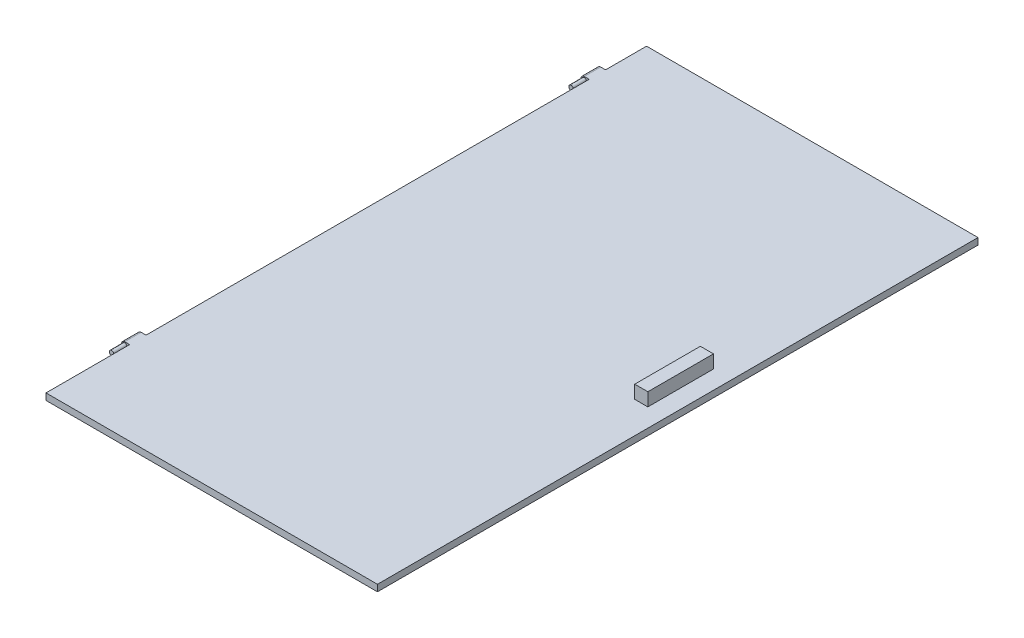
ISO-10303-21;
HEADER;
FILE_DESCRIPTION(('STEP AP214'),'2;1');
FILE_NAME('part.step','',(''),(''),'','','');
FILE_SCHEMA(('AUTOMOTIVE_DESIGN { 1 0 10303 214 1 1 1 1 }'));
ENDSEC;
DATA;
#1=APPLICATION_CONTEXT('core data for automotive mechanical design processes');
#2=APPLICATION_PROTOCOL_DEFINITION('international standard','automotive_design',2000,#1);
#3=PRODUCT_CONTEXT('',#1,'mechanical');
#4=PRODUCT('Part','Part','',(#3));
#5=PRODUCT_RELATED_PRODUCT_CATEGORY('part','',(#4));
#6=PRODUCT_DEFINITION_FORMATION('','',#4);
#7=PRODUCT_DEFINITION_CONTEXT('part definition',#1,'design');
#8=PRODUCT_DEFINITION('design','',#6,#7);
#9=PRODUCT_DEFINITION_SHAPE('','',#8);
#10=(LENGTH_UNIT() NAMED_UNIT(*) SI_UNIT(.MILLI.,.METRE.));
#11=(NAMED_UNIT(*) PLANE_ANGLE_UNIT() SI_UNIT($,.RADIAN.));
#12=(NAMED_UNIT(*) SI_UNIT($,.STERADIAN.) SOLID_ANGLE_UNIT());
#13=UNCERTAINTY_MEASURE_WITH_UNIT(LENGTH_MEASURE(1.E-05),#10,'distance_accuracy_value','');
#14=(GEOMETRIC_REPRESENTATION_CONTEXT(3) GLOBAL_UNCERTAINTY_ASSIGNED_CONTEXT((#13)) GLOBAL_UNIT_ASSIGNED_CONTEXT((#10,
#11,#12)) REPRESENTATION_CONTEXT('',''));
#15=CARTESIAN_POINT('',(0.,0.,0.));
#16=DIRECTION('',(0.,0.,1.));
#17=DIRECTION('',(1.,0.,0.));
#18=AXIS2_PLACEMENT_3D('',#15,#16,#17);
#19=CARTESIAN_POINT('',(0.,10.,0.));
#20=DIRECTION('',(0.,1.,0.));
#21=DIRECTION('',(0.,0.,1.));
#22=AXIS2_PLACEMENT_3D('',#19,#20,#21);
#23=PLANE('',#22);
#24=DIRECTION('',(1.,0.,0.));
#25=VECTOR('',#24,1.);
#26=CARTESIAN_POINT('',(-272.5,10.0000000000001,337.5));
#27=LINE('',#26,#25);
#28=CARTESIAN_POINT('',(-267.5,10.0000000000001,337.5));
#29=VERTEX_POINT('',#28);
#30=CARTESIAN_POINT('',(-260.,10.,337.5));
#31=VERTEX_POINT('',#30);
#32=EDGE_CURVE('E203',#29,#31,#27,.T.);
#33=ORIENTED_EDGE('',*,*,#32,.F.);
#34=DIRECTION('',(0.,0.,-1.));
#35=VECTOR('',#34,1.);
#36=CARTESIAN_POINT('',(-267.5,10.,362.5));
#37=LINE('',#36,#35);
#38=CARTESIAN_POINT('',(-267.5,10.0000000000001,362.5));
#39=VERTEX_POINT('',#38);
#40=EDGE_CURVE('E279',#29,#39,#37,.F.);
#41=ORIENTED_EDGE('',*,*,#40,.T.);
#42=DIRECTION('',(1.,0.,0.));
#43=VECTOR('',#42,1.);
#44=CARTESIAN_POINT('',(-272.5,10.0000000000001,362.5));
#45=LINE('',#44,#43);
#46=CARTESIAN_POINT('',(-260.,10.,362.5));
#47=VERTEX_POINT('',#46);
#48=EDGE_CURVE('E205',#39,#47,#45,.T.);
#49=ORIENTED_EDGE('',*,*,#48,.T.);
#50=DIRECTION('',(0.,0.,1.));
#51=VECTOR('',#50,1.);
#52=CARTESIAN_POINT('',(-260.,10.,490.));
#53=LINE('',#52,#51);
#54=CARTESIAN_POINT('',(-260.,10.,490.));
#55=VERTEX_POINT('',#54);
#56=EDGE_CURVE('E229',#47,#55,#53,.T.);
#57=ORIENTED_EDGE('',*,*,#56,.T.);
#58=DIRECTION('',(1.,0.,0.));
#59=VECTOR('',#58,1.);
#60=CARTESIAN_POINT('',(245.,10.,490.));
#61=LINE('',#60,#59);
#62=CARTESIAN_POINT('',(245.,10.,490.));
#63=VERTEX_POINT('',#62);
#64=EDGE_CURVE('E227',#55,#63,#61,.T.);
#65=ORIENTED_EDGE('',*,*,#64,.T.);
#66=DIRECTION('',(0.,0.,-1.));
#67=VECTOR('',#66,1.);
#68=CARTESIAN_POINT('',(245.,10.,490.));
#69=LINE('',#68,#67);
#70=CARTESIAN_POINT('',(245.,10.,-425.));
#71=VERTEX_POINT('',#70);
#72=EDGE_CURVE('E231',#63,#71,#69,.T.);
#73=ORIENTED_EDGE('',*,*,#72,.T.);
#74=DIRECTION('',(-1.,0.,0.));
#75=VECTOR('',#74,1.);
#76=CARTESIAN_POINT('',(245.,10.,-425.));
#77=LINE('',#76,#75);
#78=CARTESIAN_POINT('',(-260.,10.,-425.));
#79=VERTEX_POINT('',#78);
#80=EDGE_CURVE('E233',#71,#79,#77,.T.);
#81=ORIENTED_EDGE('',*,*,#80,.T.);
#82=CARTESIAN_POINT('',(-260.,10.,-362.5));
#83=VERTEX_POINT('',#82);
#84=EDGE_CURVE('E224',#79,#83,#53,.T.);
#85=ORIENTED_EDGE('',*,*,#84,.T.);
#86=DIRECTION('',(1.,0.,0.));
#87=VECTOR('',#86,1.);
#88=CARTESIAN_POINT('',(-272.5,10.,-362.5));
#89=LINE('',#88,#87);
#90=CARTESIAN_POINT('',(-267.5,10.,-362.5));
#91=VERTEX_POINT('',#90);
#92=EDGE_CURVE('E219',#91,#83,#89,.T.);
#93=ORIENTED_EDGE('',*,*,#92,.F.);
#94=DIRECTION('',(0.,0.,-1.));
#95=VECTOR('',#94,1.);
#96=CARTESIAN_POINT('',(-267.5,10.,-337.5));
#97=LINE('',#96,#95);
#98=CARTESIAN_POINT('',(-267.5,10.,-337.5));
#99=VERTEX_POINT('',#98);
#100=EDGE_CURVE('E277',#91,#99,#97,.F.);
#101=ORIENTED_EDGE('',*,*,#100,.T.);
#102=DIRECTION('',(1.,0.,0.));
#103=VECTOR('',#102,1.);
#104=CARTESIAN_POINT('',(-272.5,10.,-337.5));
#105=LINE('',#104,#103);
#106=CARTESIAN_POINT('',(-260.,10.,-337.5));
#107=VERTEX_POINT('',#106);
#108=EDGE_CURVE('E221',#99,#107,#105,.T.);
#109=ORIENTED_EDGE('',*,*,#108,.T.);
#110=EDGE_CURVE('E228',#107,#31,#53,.T.);
#111=ORIENTED_EDGE('',*,*,#110,.T.);
#112=EDGE_LOOP('',(#33,#41,#49,#57,#65,#73,#81,#85,#93,#101,#109,#111));
#113=FACE_BOUND('',#112,.T.);
#114=DIRECTION('',(1.,0.,0.));
#115=VECTOR('',#114,1.);
#116=CARTESIAN_POINT('',(216.961175433675,10.,49.9999999999999));
#117=LINE('',#116,#115);
#118=CARTESIAN_POINT('',(196.961175433675,10.,49.9999999999999));
#119=VERTEX_POINT('',#118);
#120=CARTESIAN_POINT('',(216.961175433675,10.,49.9999999999999));
#121=VERTEX_POINT('',#120);
#122=EDGE_CURVE('E586',#119,#121,#117,.T.);
#123=ORIENTED_EDGE('',*,*,#122,.F.);
#124=DIRECTION('',(0.,0.,1.));
#125=VECTOR('',#124,1.);
#126=CARTESIAN_POINT('',(196.961175433675,10.,49.9999999999999));
#127=LINE('',#126,#125);
#128=CARTESIAN_POINT('',(196.961175433675,10.,-50.0000000000001));
#129=VERTEX_POINT('',#128);
#130=EDGE_CURVE('E181',#129,#119,#127,.T.);
#131=ORIENTED_EDGE('',*,*,#130,.F.);
#132=DIRECTION('',(-1.,0.,0.));
#133=VECTOR('',#132,1.);
#134=CARTESIAN_POINT('',(216.961175433675,10.,-50.0000000000001));
#135=LINE('',#134,#133);
#136=CARTESIAN_POINT('',(216.961175433675,10.,-50.0000000000001));
#137=VERTEX_POINT('',#136);
#138=EDGE_CURVE('E177',#137,#129,#135,.T.);
#139=ORIENTED_EDGE('',*,*,#138,.F.);
#140=DIRECTION('',(0.,0.,-1.));
#141=VECTOR('',#140,1.);
#142=CARTESIAN_POINT('',(216.961175433675,10.,49.9999999999999));
#143=LINE('',#142,#141);
#144=EDGE_CURVE('E583',#121,#137,#143,.T.);
#145=ORIENTED_EDGE('',*,*,#144,.F.);
#146=EDGE_LOOP('',(#123,#131,#139,#145));
#147=FACE_BOUND('',#146,.T.);
#148=ADVANCED_FACE('F33',(#113,#147),#23,.T.);
#149=CARTESIAN_POINT('',(-260.,10.,490.));
#150=DIRECTION('',(1.,0.,0.));
#151=DIRECTION('',(0.,0.,-1.));
#152=AXIS2_PLACEMENT_3D('',#149,#150,#151);
#153=PLANE('',#152);
#154=DIRECTION('',(0.,1.,0.));
#155=VECTOR('',#154,1.);
#156=CARTESIAN_POINT('',(-260.,0.,362.5));
#157=LINE('',#156,#155);
#158=CARTESIAN_POINT('',(-260.,0.,362.5));
#159=VERTEX_POINT('',#158);
#160=EDGE_CURVE('E195',#159,#47,#157,.T.);
#161=ORIENTED_EDGE('',*,*,#160,.F.);
#162=DIRECTION('',(0.,0.,1.));
#163=VECTOR('',#162,1.);
#164=CARTESIAN_POINT('',(-260.,0.,490.));
#165=LINE('',#164,#163);
#166=CARTESIAN_POINT('',(-260.,0.,490.));
#167=VERTEX_POINT('',#166);
#168=EDGE_CURVE('E223',#159,#167,#165,.T.);
#169=ORIENTED_EDGE('',*,*,#168,.T.);
#170=DIRECTION('',(0.,-1.,0.));
#171=VECTOR('',#170,1.);
#172=CARTESIAN_POINT('',(-260.,10.,490.));
#173=LINE('',#172,#171);
#174=EDGE_CURVE('E254',#55,#167,#173,.T.);
#175=ORIENTED_EDGE('',*,*,#174,.F.);
#176=ORIENTED_EDGE('',*,*,#56,.F.);
#177=EDGE_LOOP('',(#161,#169,#175,#176));
#178=FACE_BOUND('',#177,.T.);
#179=ADVANCED_FACE('F318',(#178),#153,.F.);
#180=DIRECTION('',(0.,-1.,0.));
#181=VECTOR('',#180,1.);
#182=CARTESIAN_POINT('',(-260.,0.,337.5));
#183=LINE('',#182,#181);
#184=CARTESIAN_POINT('',(-260.,0.,337.5));
#185=VERTEX_POINT('',#184);
#186=EDGE_CURVE('E198',#31,#185,#183,.T.);
#187=ORIENTED_EDGE('',*,*,#186,.F.);
#188=ORIENTED_EDGE('',*,*,#110,.F.);
#189=DIRECTION('',(0.,1.,0.));
#190=VECTOR('',#189,1.);
#191=CARTESIAN_POINT('',(-260.,0.,-337.5));
#192=LINE('',#191,#190);
#193=CARTESIAN_POINT('',(-260.,0.,-337.5));
#194=VERTEX_POINT('',#193);
#195=EDGE_CURVE('E209',#194,#107,#192,.T.);
#196=ORIENTED_EDGE('',*,*,#195,.F.);
#197=EDGE_CURVE('E240',#194,#185,#165,.T.);
#198=ORIENTED_EDGE('',*,*,#197,.T.);
#199=EDGE_LOOP('',(#187,#188,#196,#198));
#200=FACE_BOUND('',#199,.T.);
#201=ADVANCED_FACE('F350',(#200),#153,.F.);
#202=DIRECTION('',(0.,-1.,0.));
#203=VECTOR('',#202,1.);
#204=CARTESIAN_POINT('',(-260.,0.,-362.5));
#205=LINE('',#204,#203);
#206=CARTESIAN_POINT('',(-260.,0.,-362.5));
#207=VERTEX_POINT('',#206);
#208=EDGE_CURVE('E212',#83,#207,#205,.T.);
#209=ORIENTED_EDGE('',*,*,#208,.F.);
#210=ORIENTED_EDGE('',*,*,#84,.F.);
#211=DIRECTION('',(0.,-1.,0.));
#212=VECTOR('',#211,1.);
#213=CARTESIAN_POINT('',(-260.,10.,-425.));
#214=LINE('',#213,#212);
#215=CARTESIAN_POINT('',(-260.,0.,-425.));
#216=VERTEX_POINT('',#215);
#217=EDGE_CURVE('E235',#79,#216,#214,.T.);
#218=ORIENTED_EDGE('',*,*,#217,.T.);
#219=EDGE_CURVE('E236',#216,#207,#165,.T.);
#220=ORIENTED_EDGE('',*,*,#219,.T.);
#221=EDGE_LOOP('',(#209,#210,#218,#220));
#222=FACE_BOUND('',#221,.T.);
#223=ADVANCED_FACE('F338',(#222),#153,.F.);
#224=CARTESIAN_POINT('',(245.,10.,490.));
#225=DIRECTION('',(0.,0.,-1.));
#226=DIRECTION('',(-1.,0.,0.));
#227=AXIS2_PLACEMENT_3D('',#224,#225,#226);
#228=PLANE('',#227);
#229=DIRECTION('',(1.,0.,0.));
#230=VECTOR('',#229,1.);
#231=CARTESIAN_POINT('',(245.,0.,490.));
#232=LINE('',#231,#230);
#233=CARTESIAN_POINT('',(245.,0.,490.));
#234=VERTEX_POINT('',#233);
#235=EDGE_CURVE('E239',#167,#234,#232,.T.);
#236=ORIENTED_EDGE('',*,*,#235,.T.);
#237=DIRECTION('',(0.,-1.,0.));
#238=VECTOR('',#237,1.);
#239=CARTESIAN_POINT('',(245.,10.,490.));
#240=LINE('',#239,#238);
#241=EDGE_CURVE('E251',#63,#234,#240,.T.);
#242=ORIENTED_EDGE('',*,*,#241,.F.);
#243=ORIENTED_EDGE('',*,*,#64,.F.);
#244=ORIENTED_EDGE('',*,*,#174,.T.);
#245=EDGE_LOOP('',(#236,#242,#243,#244));
#246=FACE_BOUND('',#245,.T.);
#247=ADVANCED_FACE('F316',(#246),#228,.F.);
#248=CARTESIAN_POINT('',(245.,10.,490.));
#249=DIRECTION('',(-1.,0.,0.));
#250=DIRECTION('',(0.,0.,1.));
#251=AXIS2_PLACEMENT_3D('',#248,#249,#250);
#252=PLANE('',#251);
#253=DIRECTION('',(0.,0.,-1.));
#254=VECTOR('',#253,1.);
#255=CARTESIAN_POINT('',(245.,0.,490.));
#256=LINE('',#255,#254);
#257=CARTESIAN_POINT('',(245.,0.,-425.));
#258=VERTEX_POINT('',#257);
#259=EDGE_CURVE('E242',#234,#258,#256,.T.);
#260=ORIENTED_EDGE('',*,*,#259,.T.);
#261=DIRECTION('',(0.,-1.,0.));
#262=VECTOR('',#261,1.);
#263=CARTESIAN_POINT('',(245.,10.,-425.));
#264=LINE('',#263,#262);
#265=EDGE_CURVE('E248',#71,#258,#264,.T.);
#266=ORIENTED_EDGE('',*,*,#265,.F.);
#267=ORIENTED_EDGE('',*,*,#72,.F.);
#268=ORIENTED_EDGE('',*,*,#241,.T.);
#269=EDGE_LOOP('',(#260,#266,#267,#268));
#270=FACE_BOUND('',#269,.T.);
#271=ADVANCED_FACE('F327',(#270),#252,.F.);
#272=CARTESIAN_POINT('',(245.,10.,-425.));
#273=DIRECTION('',(0.,0.,1.));
#274=DIRECTION('',(1.,0.,0.));
#275=AXIS2_PLACEMENT_3D('',#272,#273,#274);
#276=PLANE('',#275);
#277=DIRECTION('',(-1.,0.,0.));
#278=VECTOR('',#277,1.);
#279=CARTESIAN_POINT('',(245.,0.,-425.));
#280=LINE('',#279,#278);
#281=EDGE_CURVE('E244',#258,#216,#280,.T.);
#282=ORIENTED_EDGE('',*,*,#281,.T.);
#283=ORIENTED_EDGE('',*,*,#217,.F.);
#284=ORIENTED_EDGE('',*,*,#80,.F.);
#285=ORIENTED_EDGE('',*,*,#265,.T.);
#286=EDGE_LOOP('',(#282,#283,#284,#285));
#287=FACE_BOUND('',#286,.T.);
#288=ADVANCED_FACE('F334',(#287),#276,.F.);
#289=CARTESIAN_POINT('',(0.,0.,0.));
#290=DIRECTION('',(0.,1.,0.));
#291=DIRECTION('',(0.,0.,1.));
#292=AXIS2_PLACEMENT_3D('',#289,#290,#291);
#293=PLANE('',#292);
#294=DIRECTION('',(1.,0.,0.));
#295=VECTOR('',#294,1.);
#296=CARTESIAN_POINT('',(-272.5,0.,362.5));
#297=LINE('',#296,#295);
#298=CARTESIAN_POINT('',(-267.5,0.,362.5));
#299=VERTEX_POINT('',#298);
#300=EDGE_CURVE('E207',#299,#159,#297,.T.);
#301=ORIENTED_EDGE('',*,*,#300,.F.);
#302=DIRECTION('',(0.,0.,1.));
#303=VECTOR('',#302,1.);
#304=CARTESIAN_POINT('',(-267.5,0.,0.));
#305=LINE('',#304,#303);
#306=CARTESIAN_POINT('',(-267.5,0.,337.5));
#307=VERTEX_POINT('',#306);
#308=EDGE_CURVE('E270',#299,#307,#305,.F.);
#309=ORIENTED_EDGE('',*,*,#308,.T.);
#310=DIRECTION('',(1.,0.,0.));
#311=VECTOR('',#310,1.);
#312=CARTESIAN_POINT('',(-272.5,0.,337.5));
#313=LINE('',#312,#311);
#314=EDGE_CURVE('E201',#307,#185,#313,.T.);
#315=ORIENTED_EDGE('',*,*,#314,.T.);
#316=ORIENTED_EDGE('',*,*,#197,.F.);
#317=DIRECTION('',(1.,0.,0.));
#318=VECTOR('',#317,1.);
#319=CARTESIAN_POINT('',(-272.5,0.,-337.5));
#320=LINE('',#319,#318);
#321=CARTESIAN_POINT('',(-267.5,0.,-337.5));
#322=VERTEX_POINT('',#321);
#323=EDGE_CURVE('E215',#322,#194,#320,.T.);
#324=ORIENTED_EDGE('',*,*,#323,.F.);
#325=DIRECTION('',(0.,0.,1.));
#326=VECTOR('',#325,1.);
#327=CARTESIAN_POINT('',(-267.5,0.,0.));
#328=LINE('',#327,#326);
#329=CARTESIAN_POINT('',(-267.5,0.,-362.5));
#330=VERTEX_POINT('',#329);
#331=EDGE_CURVE('E267',#322,#330,#328,.F.);
#332=ORIENTED_EDGE('',*,*,#331,.T.);
#333=DIRECTION('',(1.,0.,0.));
#334=VECTOR('',#333,1.);
#335=CARTESIAN_POINT('',(-272.5,0.,-362.5));
#336=LINE('',#335,#334);
#337=EDGE_CURVE('E217',#330,#207,#336,.T.);
#338=ORIENTED_EDGE('',*,*,#337,.T.);
#339=ORIENTED_EDGE('',*,*,#219,.F.);
#340=ORIENTED_EDGE('',*,*,#281,.F.);
#341=ORIENTED_EDGE('',*,*,#259,.F.);
#342=ORIENTED_EDGE('',*,*,#235,.F.);
#343=ORIENTED_EDGE('',*,*,#168,.F.);
#344=EDGE_LOOP('',(#301,#309,#315,#316,#324,#332,#338,#339,#340,#341,#342,#343));
#345=FACE_BOUND('',#344,.T.);
#346=ADVANCED_FACE('F324',(#345),#293,.F.);
#347=CARTESIAN_POINT('',(-272.5,0.,-337.5));
#348=DIRECTION('',(0.,0.,-1.));
#349=DIRECTION('',(-1.,0.,0.));
#350=AXIS2_PLACEMENT_3D('',#347,#348,#349);
#351=PLANE('',#350);
#352=CARTESIAN_POINT('',(-267.5,5.,-337.5));
#353=DIRECTION('',(0.,0.,-1.));
#354=DIRECTION('',(-1.,0.,0.));
#355=AXIS2_PLACEMENT_3D('',#352,#353,#354);
#356=CIRCLE('',#355,3.50000000000002);
#357=CARTESIAN_POINT('',(-271.,5.,-337.5));
#358=VERTEX_POINT('',#357);
#359=EDGE_CURVE('E257',#358,#358,#356,.F.);
#360=ORIENTED_EDGE('',*,*,#359,.F.);
#361=EDGE_LOOP('',(#360));
#362=FACE_BOUND('',#361,.T.);
#363=CARTESIAN_POINT('',(-267.5,5.,-337.5));
#364=DIRECTION('',(0.,0.,-1.));
#365=DIRECTION('',(-1.,0.,0.));
#366=AXIS2_PLACEMENT_3D('',#363,#364,#365);
#367=CIRCLE('',#366,5.);
#368=CARTESIAN_POINT('',(-272.5,5.,-337.5));
#369=VERTEX_POINT('',#368);
#370=EDGE_CURVE('E281',#99,#369,#367,.F.);
#371=ORIENTED_EDGE('',*,*,#370,.T.);
#372=CARTESIAN_POINT('',(-267.5,5.,-337.5));
#373=DIRECTION('',(0.,0.,-1.));
#374=DIRECTION('',(-1.,0.,0.));
#375=AXIS2_PLACEMENT_3D('',#372,#373,#374);
#376=CIRCLE('',#375,5.);
#377=EDGE_CURVE('E283',#369,#322,#376,.F.);
#378=ORIENTED_EDGE('',*,*,#377,.T.);
#379=ORIENTED_EDGE('',*,*,#323,.T.);
#380=ORIENTED_EDGE('',*,*,#195,.T.);
#381=ORIENTED_EDGE('',*,*,#108,.F.);
#382=EDGE_LOOP('',(#371,#378,#379,#380,#381));
#383=FACE_BOUND('',#382,.T.);
#384=ADVANCED_FACE('F346',(#362,#383),#351,.F.);
#385=CARTESIAN_POINT('',(-272.5,0.,-362.5));
#386=DIRECTION('',(0.,0.,1.));
#387=DIRECTION('',(1.,0.,0.));
#388=AXIS2_PLACEMENT_3D('',#385,#386,#387);
#389=PLANE('',#388);
#390=ORIENTED_EDGE('',*,*,#337,.F.);
#391=CARTESIAN_POINT('',(-267.5,5.,-362.5));
#392=DIRECTION('',(0.,0.,1.));
#393=DIRECTION('',(1.,0.,0.));
#394=AXIS2_PLACEMENT_3D('',#391,#392,#393);
#395=CIRCLE('',#394,5.);
#396=CARTESIAN_POINT('',(-272.5,5.,-362.5));
#397=VERTEX_POINT('',#396);
#398=EDGE_CURVE('E11',#330,#397,#395,.F.);
#399=ORIENTED_EDGE('',*,*,#398,.T.);
#400=CARTESIAN_POINT('',(-267.5,5.,-362.5));
#401=DIRECTION('',(0.,0.,1.));
#402=DIRECTION('',(1.,0.,0.));
#403=AXIS2_PLACEMENT_3D('',#400,#401,#402);
#404=CIRCLE('',#403,5.);
#405=EDGE_CURVE('E42',#397,#91,#404,.F.);
#406=ORIENTED_EDGE('',*,*,#405,.T.);
#407=ORIENTED_EDGE('',*,*,#92,.T.);
#408=ORIENTED_EDGE('',*,*,#208,.T.);
#409=EDGE_LOOP('',(#390,#399,#406,#407,#408));
#410=FACE_BOUND('',#409,.T.);
#411=ADVANCED_FACE('F339',(#410),#389,.F.);
#412=CARTESIAN_POINT('',(-272.5,0.,362.5));
#413=DIRECTION('',(0.,0.,-1.));
#414=DIRECTION('',(-1.,0.,0.));
#415=AXIS2_PLACEMENT_3D('',#412,#413,#414);
#416=PLANE('',#415);
#417=CARTESIAN_POINT('',(-267.5,5.,362.5));
#418=DIRECTION('',(0.,0.,-1.));
#419=DIRECTION('',(-1.,0.,0.));
#420=AXIS2_PLACEMENT_3D('',#417,#418,#419);
#421=CIRCLE('',#420,3.50000000000002);
#422=CARTESIAN_POINT('',(-271.,5.,362.5));
#423=VERTEX_POINT('',#422);
#424=EDGE_CURVE('E260',#423,#423,#421,.F.);
#425=ORIENTED_EDGE('',*,*,#424,.F.);
#426=EDGE_LOOP('',(#425));
#427=FACE_BOUND('',#426,.T.);
#428=CARTESIAN_POINT('',(-267.5,5.,362.5));
#429=DIRECTION('',(0.,0.,-1.));
#430=DIRECTION('',(-1.,0.,0.));
#431=AXIS2_PLACEMENT_3D('',#428,#429,#430);
#432=CIRCLE('',#431,5.);
#433=CARTESIAN_POINT('',(-272.5,5.,362.5));
#434=VERTEX_POINT('',#433);
#435=EDGE_CURVE('E263',#39,#434,#432,.F.);
#436=ORIENTED_EDGE('',*,*,#435,.T.);
#437=CARTESIAN_POINT('',(-267.5,5.,362.5));
#438=DIRECTION('',(0.,0.,-1.));
#439=DIRECTION('',(-1.,0.,0.));
#440=AXIS2_PLACEMENT_3D('',#437,#438,#439);
#441=CIRCLE('',#440,5.);
#442=EDGE_CURVE('E265',#434,#299,#441,.F.);
#443=ORIENTED_EDGE('',*,*,#442,.T.);
#444=ORIENTED_EDGE('',*,*,#300,.T.);
#445=ORIENTED_EDGE('',*,*,#160,.T.);
#446=ORIENTED_EDGE('',*,*,#48,.F.);
#447=EDGE_LOOP('',(#436,#443,#444,#445,#446));
#448=FACE_BOUND('',#447,.T.);
#449=ADVANCED_FACE('F353',(#427,#448),#416,.F.);
#450=CARTESIAN_POINT('',(-272.5,0.,337.5));
#451=DIRECTION('',(0.,0.,1.));
#452=DIRECTION('',(1.,0.,0.));
#453=AXIS2_PLACEMENT_3D('',#450,#451,#452);
#454=PLANE('',#453);
#455=ORIENTED_EDGE('',*,*,#314,.F.);
#456=CARTESIAN_POINT('',(-267.5,5.,337.5));
#457=DIRECTION('',(0.,0.,1.));
#458=DIRECTION('',(1.,0.,0.));
#459=AXIS2_PLACEMENT_3D('',#456,#457,#458);
#460=CIRCLE('',#459,5.);
#461=CARTESIAN_POINT('',(-272.5,5.,337.5));
#462=VERTEX_POINT('',#461);
#463=EDGE_CURVE('E275',#307,#462,#460,.F.);
#464=ORIENTED_EDGE('',*,*,#463,.T.);
#465=CARTESIAN_POINT('',(-267.5,5.,337.5));
#466=DIRECTION('',(0.,0.,1.));
#467=DIRECTION('',(1.,0.,0.));
#468=AXIS2_PLACEMENT_3D('',#465,#466,#467);
#469=CIRCLE('',#468,5.);
#470=EDGE_CURVE('E273',#462,#29,#469,.F.);
#471=ORIENTED_EDGE('',*,*,#470,.T.);
#472=ORIENTED_EDGE('',*,*,#32,.T.);
#473=ORIENTED_EDGE('',*,*,#186,.T.);
#474=EDGE_LOOP('',(#455,#464,#471,#472,#473));
#475=FACE_BOUND('',#474,.T.);
#476=ADVANCED_FACE('F299',(#475),#454,.F.);
#477=CARTESIAN_POINT('',(-267.5,5.,-317.5));
#478=DIRECTION('',(0.,0.,-1.));
#479=DIRECTION('',(-1.,0.,0.));
#480=AXIS2_PLACEMENT_3D('',#477,#478,#479);
#481=CYLINDRICAL_SURFACE('',#480,3.50000000000002);
#482=CARTESIAN_POINT('',(-267.5,5.,-317.5));
#483=DIRECTION('',(0.,0.,1.));
#484=DIRECTION('',(1.,0.,0.));
#485=AXIS2_PLACEMENT_3D('',#482,#483,#484);
#486=CIRCLE('',#485,3.50000000000002);
#487=CARTESIAN_POINT('',(-264.,5.,-317.5));
#488=VERTEX_POINT('',#487);
#489=EDGE_CURVE('E192',#488,#488,#486,.T.);
#490=ORIENTED_EDGE('',*,*,#489,.F.);
#491=EDGE_LOOP('',(#490));
#492=FACE_BOUND('',#491,.T.);
#493=ORIENTED_EDGE('',*,*,#359,.T.);
#494=EDGE_LOOP('',(#493));
#495=FACE_BOUND('',#494,.T.);
#496=ADVANCED_FACE('F361',(#492,#495),#481,.T.);
#497=CARTESIAN_POINT('',(-267.5,5.,-317.5));
#498=DIRECTION('',(0.,0.,1.));
#499=DIRECTION('',(1.,0.,0.));
#500=AXIS2_PLACEMENT_3D('',#497,#498,#499);
#501=PLANE('',#500);
#502=ORIENTED_EDGE('',*,*,#489,.T.);
#503=EDGE_LOOP('',(#502));
#504=FACE_BOUND('',#503,.T.);
#505=ADVANCED_FACE('F419',(#504),#501,.T.);
#506=CARTESIAN_POINT('',(-267.5,5.,382.5));
#507=DIRECTION('',(0.,0.,-1.));
#508=DIRECTION('',(-1.,0.,0.));
#509=AXIS2_PLACEMENT_3D('',#506,#507,#508);
#510=CYLINDRICAL_SURFACE('',#509,3.50000000000002);
#511=CARTESIAN_POINT('',(-267.5,5.,382.5));
#512=DIRECTION('',(0.,0.,1.));
#513=DIRECTION('',(1.,0.,0.));
#514=AXIS2_PLACEMENT_3D('',#511,#512,#513);
#515=CIRCLE('',#514,3.50000000000002);
#516=CARTESIAN_POINT('',(-264.,5.,382.5));
#517=VERTEX_POINT('',#516);
#518=EDGE_CURVE('E189',#517,#517,#515,.T.);
#519=ORIENTED_EDGE('',*,*,#518,.F.);
#520=EDGE_LOOP('',(#519));
#521=FACE_BOUND('',#520,.T.);
#522=ORIENTED_EDGE('',*,*,#424,.T.);
#523=EDGE_LOOP('',(#522));
#524=FACE_BOUND('',#523,.T.);
#525=ADVANCED_FACE('F410',(#521,#524),#510,.T.);
#526=CARTESIAN_POINT('',(-267.5,5.,382.5));
#527=DIRECTION('',(0.,0.,1.));
#528=DIRECTION('',(1.,0.,0.));
#529=AXIS2_PLACEMENT_3D('',#526,#527,#528);
#530=PLANE('',#529);
#531=ORIENTED_EDGE('',*,*,#518,.T.);
#532=EDGE_LOOP('',(#531));
#533=FACE_BOUND('',#532,.T.);
#534=ADVANCED_FACE('F384',(#533),#530,.T.);
#535=CARTESIAN_POINT('',(-267.5,5.,0.));
#536=DIRECTION('',(0.,0.,1.));
#537=DIRECTION('',(1.,0.,0.));
#538=AXIS2_PLACEMENT_3D('',#535,#536,#537);
#539=CYLINDRICAL_SURFACE('',#538,5.);
#540=ORIENTED_EDGE('',*,*,#40,.F.);
#541=ORIENTED_EDGE('',*,*,#470,.F.);
#542=DIRECTION('',(0.,0.,-1.));
#543=VECTOR('',#542,1.);
#544=CARTESIAN_POINT('',(-272.5,5.,337.5));
#545=LINE('',#544,#543);
#546=EDGE_CURVE('E185',#434,#462,#545,.T.);
#547=ORIENTED_EDGE('',*,*,#546,.F.);
#548=ORIENTED_EDGE('',*,*,#435,.F.);
#549=EDGE_LOOP('',(#540,#541,#547,#548));
#550=FACE_BOUND('',#549,.T.);
#551=ADVANCED_FACE('F295',(#550),#539,.T.);
#552=CARTESIAN_POINT('',(-267.5,5.,0.));
#553=DIRECTION('',(0.,0.,1.));
#554=DIRECTION('',(1.,0.,0.));
#555=AXIS2_PLACEMENT_3D('',#552,#553,#554);
#556=CYLINDRICAL_SURFACE('',#555,5.);
#557=ORIENTED_EDGE('',*,*,#463,.F.);
#558=ORIENTED_EDGE('',*,*,#308,.F.);
#559=ORIENTED_EDGE('',*,*,#442,.F.);
#560=ORIENTED_EDGE('',*,*,#546,.T.);
#561=EDGE_LOOP('',(#557,#558,#559,#560));
#562=FACE_BOUND('',#561,.T.);
#563=ADVANCED_FACE('F289',(#562),#556,.T.);
#564=CARTESIAN_POINT('',(-267.5,5.,0.));
#565=DIRECTION('',(0.,0.,1.));
#566=DIRECTION('',(1.,0.,0.));
#567=AXIS2_PLACEMENT_3D('',#564,#565,#566);
#568=CYLINDRICAL_SURFACE('',#567,5.);
#569=ORIENTED_EDGE('',*,*,#100,.F.);
#570=ORIENTED_EDGE('',*,*,#405,.F.);
#571=DIRECTION('',(0.,0.,-1.));
#572=VECTOR('',#571,1.);
#573=CARTESIAN_POINT('',(-272.5,5.,-362.5));
#574=LINE('',#573,#572);
#575=EDGE_CURVE('E37',#369,#397,#574,.T.);
#576=ORIENTED_EDGE('',*,*,#575,.F.);
#577=ORIENTED_EDGE('',*,*,#370,.F.);
#578=EDGE_LOOP('',(#569,#570,#576,#577));
#579=FACE_BOUND('',#578,.T.);
#580=ADVANCED_FACE('F35',(#579),#568,.T.);
#581=CARTESIAN_POINT('',(-267.5,5.,0.));
#582=DIRECTION('',(0.,0.,1.));
#583=DIRECTION('',(1.,0.,0.));
#584=AXIS2_PLACEMENT_3D('',#581,#582,#583);
#585=CYLINDRICAL_SURFACE('',#584,5.);
#586=ORIENTED_EDGE('',*,*,#398,.F.);
#587=ORIENTED_EDGE('',*,*,#331,.F.);
#588=ORIENTED_EDGE('',*,*,#377,.F.);
#589=ORIENTED_EDGE('',*,*,#575,.T.);
#590=EDGE_LOOP('',(#586,#587,#588,#589));
#591=FACE_BOUND('',#590,.T.);
#592=ADVANCED_FACE('F385',(#591),#585,.T.);
#593=CARTESIAN_POINT('',(196.961175433675,30.,49.9999999999999));
#594=DIRECTION('',(1.,0.,0.));
#595=DIRECTION('',(0.,0.,-1.));
#596=AXIS2_PLACEMENT_3D('',#593,#594,#595);
#597=PLANE('',#596);
#598=ORIENTED_EDGE('',*,*,#130,.T.);
#599=DIRECTION('',(0.,-1.,0.));
#600=VECTOR('',#599,1.);
#601=CARTESIAN_POINT('',(196.961175433675,30.,49.9999999999999));
#602=LINE('',#601,#600);
#603=CARTESIAN_POINT('',(196.961175433675,30.,49.9999999999999));
#604=VERTEX_POINT('',#603);
#605=EDGE_CURVE('E162',#604,#119,#602,.T.);
#606=ORIENTED_EDGE('',*,*,#605,.F.);
#607=DIRECTION('',(0.,0.,1.));
#608=VECTOR('',#607,1.);
#609=CARTESIAN_POINT('',(196.961175433675,30.,49.9999999999999));
#610=LINE('',#609,#608);
#611=CARTESIAN_POINT('',(196.961175433675,30.,-50.0000000000001));
#612=VERTEX_POINT('',#611);
#613=EDGE_CURVE('E169',#612,#604,#610,.T.);
#614=ORIENTED_EDGE('',*,*,#613,.F.);
#615=DIRECTION('',(0.,-1.,0.));
#616=VECTOR('',#615,1.);
#617=CARTESIAN_POINT('',(196.961175433675,30.,-50.0000000000001));
#618=LINE('',#617,#616);
#619=EDGE_CURVE('E581',#612,#129,#618,.T.);
#620=ORIENTED_EDGE('',*,*,#619,.T.);
#621=EDGE_LOOP('',(#598,#606,#614,#620));
#622=FACE_BOUND('',#621,.T.);
#623=ADVANCED_FACE('F179',(#622),#597,.F.);
#624=CARTESIAN_POINT('',(216.961175433675,30.,49.9999999999999));
#625=DIRECTION('',(0.,0.,-1.));
#626=DIRECTION('',(-1.,0.,0.));
#627=AXIS2_PLACEMENT_3D('',#624,#625,#626);
#628=PLANE('',#627);
#629=ORIENTED_EDGE('',*,*,#122,.T.);
#630=DIRECTION('',(0.,-1.,0.));
#631=VECTOR('',#630,1.);
#632=CARTESIAN_POINT('',(216.961175433675,30.,49.9999999999999));
#633=LINE('',#632,#631);
#634=CARTESIAN_POINT('',(216.961175433675,30.,49.9999999999999));
#635=VERTEX_POINT('',#634);
#636=EDGE_CURVE('E165',#635,#121,#633,.T.);
#637=ORIENTED_EDGE('',*,*,#636,.F.);
#638=DIRECTION('',(1.,0.,0.));
#639=VECTOR('',#638,1.);
#640=CARTESIAN_POINT('',(216.961175433675,30.,49.9999999999999));
#641=LINE('',#640,#639);
#642=EDGE_CURVE('E158',#604,#635,#641,.T.);
#643=ORIENTED_EDGE('',*,*,#642,.F.);
#644=ORIENTED_EDGE('',*,*,#605,.T.);
#645=EDGE_LOOP('',(#629,#637,#643,#644));
#646=FACE_BOUND('',#645,.T.);
#647=ADVANCED_FACE('F160',(#646),#628,.F.);
#648=CARTESIAN_POINT('',(216.961175433675,30.,49.9999999999999));
#649=DIRECTION('',(-1.,0.,0.));
#650=DIRECTION('',(0.,0.,1.));
#651=AXIS2_PLACEMENT_3D('',#648,#649,#650);
#652=PLANE('',#651);
#653=ORIENTED_EDGE('',*,*,#144,.T.);
#654=DIRECTION('',(0.,-1.,0.));
#655=VECTOR('',#654,1.);
#656=CARTESIAN_POINT('',(216.961175433675,30.,-50.0000000000001));
#657=LINE('',#656,#655);
#658=CARTESIAN_POINT('',(216.961175433675,30.,-50.0000000000001));
#659=VERTEX_POINT('',#658);
#660=EDGE_CURVE('E50',#659,#137,#657,.T.);
#661=ORIENTED_EDGE('',*,*,#660,.F.);
#662=DIRECTION('',(0.,0.,-1.));
#663=VECTOR('',#662,1.);
#664=CARTESIAN_POINT('',(216.961175433675,30.,49.9999999999999));
#665=LINE('',#664,#663);
#666=EDGE_CURVE('E168',#635,#659,#665,.T.);
#667=ORIENTED_EDGE('',*,*,#666,.F.);
#668=ORIENTED_EDGE('',*,*,#636,.T.);
#669=EDGE_LOOP('',(#653,#661,#667,#668));
#670=FACE_BOUND('',#669,.T.);
#671=ADVANCED_FACE('F550',(#670),#652,.F.);
#672=CARTESIAN_POINT('',(216.961175433675,30.,-50.0000000000001));
#673=DIRECTION('',(0.,0.,1.));
#674=DIRECTION('',(1.,0.,0.));
#675=AXIS2_PLACEMENT_3D('',#672,#673,#674);
#676=PLANE('',#675);
#677=ORIENTED_EDGE('',*,*,#138,.T.);
#678=ORIENTED_EDGE('',*,*,#619,.F.);
#679=DIRECTION('',(-1.,0.,0.));
#680=VECTOR('',#679,1.);
#681=CARTESIAN_POINT('',(216.961175433675,30.,-50.0000000000001));
#682=LINE('',#681,#680);
#683=EDGE_CURVE('E173',#659,#612,#682,.T.);
#684=ORIENTED_EDGE('',*,*,#683,.F.);
#685=ORIENTED_EDGE('',*,*,#660,.T.);
#686=EDGE_LOOP('',(#677,#678,#684,#685));
#687=FACE_BOUND('',#686,.T.);
#688=ADVANCED_FACE('F558',(#687),#676,.F.);
#689=CARTESIAN_POINT('',(0.,30.,0.));
#690=DIRECTION('',(0.,1.,0.));
#691=DIRECTION('',(0.,0.,1.));
#692=AXIS2_PLACEMENT_3D('',#689,#690,#691);
#693=PLANE('',#692);
#694=ORIENTED_EDGE('',*,*,#613,.T.);
#695=ORIENTED_EDGE('',*,*,#642,.T.);
#696=ORIENTED_EDGE('',*,*,#666,.T.);
#697=ORIENTED_EDGE('',*,*,#683,.T.);
#698=EDGE_LOOP('',(#694,#695,#696,#697));
#699=FACE_BOUND('',#698,.T.);
#700=ADVANCED_FACE('F172',(#699),#693,.T.);
#701=CLOSED_SHELL('',(#148,#179,#201,#223,#247,#271,#288,#346,#384,#411,#449,#476,#496,#505,
#525,#534,#551,#563,#580,#592,#623,#647,#671,#688,#700));
#702=MANIFOLD_SOLID_BREP('B2',#701);
#703=ADVANCED_BREP_SHAPE_REPRESENTATION('',(#18,#702),#14);
#704=SHAPE_DEFINITION_REPRESENTATION(#9,#703);
ENDSEC;
END-ISO-10303-21;
